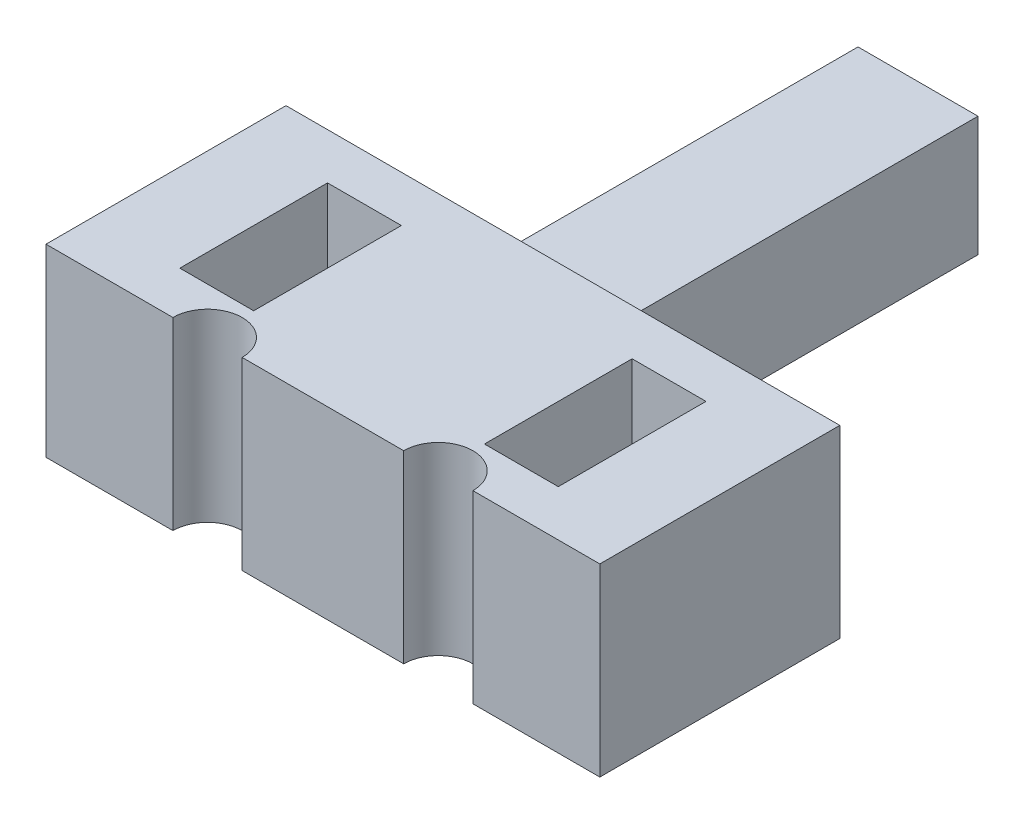
ISO-10303-21;
HEADER;
FILE_DESCRIPTION(('STEP AP214'),'2;1');
FILE_NAME('part.step','',(''),(''),'','','');
FILE_SCHEMA(('AUTOMOTIVE_DESIGN { 1 0 10303 214 1 1 1 1 }'));
ENDSEC;
DATA;
#1=APPLICATION_CONTEXT('core data for automotive mechanical design processes');
#2=APPLICATION_PROTOCOL_DEFINITION('international standard','automotive_design',2000,#1);
#3=PRODUCT_CONTEXT('',#1,'mechanical');
#4=PRODUCT('Part','Part','',(#3));
#5=PRODUCT_RELATED_PRODUCT_CATEGORY('part','',(#4));
#6=PRODUCT_DEFINITION_FORMATION('','',#4);
#7=PRODUCT_DEFINITION_CONTEXT('part definition',#1,'design');
#8=PRODUCT_DEFINITION('design','',#6,#7);
#9=PRODUCT_DEFINITION_SHAPE('','',#8);
#10=(LENGTH_UNIT() NAMED_UNIT(*) SI_UNIT(.MILLI.,.METRE.));
#11=(NAMED_UNIT(*) PLANE_ANGLE_UNIT() SI_UNIT($,.RADIAN.));
#12=(NAMED_UNIT(*) SI_UNIT($,.STERADIAN.) SOLID_ANGLE_UNIT());
#13=UNCERTAINTY_MEASURE_WITH_UNIT(LENGTH_MEASURE(1.E-05),#10,'distance_accuracy_value','');
#14=(GEOMETRIC_REPRESENTATION_CONTEXT(3) GLOBAL_UNCERTAINTY_ASSIGNED_CONTEXT((#13)) GLOBAL_UNIT_ASSIGNED_CONTEXT((#10,
#11,#12)) REPRESENTATION_CONTEXT('',''));
#15=CARTESIAN_POINT('',(0.,0.,0.));
#16=DIRECTION('',(0.,0.,1.));
#17=DIRECTION('',(1.,0.,0.));
#18=AXIS2_PLACEMENT_3D('',#15,#16,#17);
#19=CARTESIAN_POINT('',(-0.402957670863898,0.,-5.3));
#20=DIRECTION('',(-0.707106781186551,0.,-0.707106781186544));
#21=DIRECTION('',(-0.707106781186544,0.,0.707106781186551));
#22=AXIS2_PLACEMENT_3D('',#19,#20,#21);
#23=PLANE('',#22);
#24=DIRECTION('',(-0.577350269189624,0.577350269189625,0.577350269189629));
#25=VECTOR('',#24,1.);
#26=CARTESIAN_POINT('',(-0.402957670863898,1.64939499919042,-5.3));
#27=LINE('',#26,#25);
#28=CARTESIAN_POINT('',(-0.402957670863898,1.64939499919042,-5.3));
#29=VERTEX_POINT('',#28);
#30=CARTESIAN_POINT('',(-0.602957670863896,1.84939499919042,-5.1));
#31=VERTEX_POINT('',#30);
#32=EDGE_CURVE('E305',#29,#31,#27,.T.);
#33=ORIENTED_EDGE('',*,*,#32,.F.);
#34=DIRECTION('',(0.,1.,0.));
#35=VECTOR('',#34,1.);
#36=CARTESIAN_POINT('',(-0.402957670863898,0.,-5.3));
#37=LINE('',#36,#35);
#38=CARTESIAN_POINT('',(-0.402957670863898,0.749394999190415,-5.3));
#39=VERTEX_POINT('',#38);
#40=EDGE_CURVE('E300',#39,#29,#37,.T.);
#41=ORIENTED_EDGE('',*,*,#40,.F.);
#42=DIRECTION('',(0.577350269189624,0.577350269189624,-0.577350269189629));
#43=VECTOR('',#42,1.);
#44=CARTESIAN_POINT('',(-0.602957670863896,0.549394999190417,-5.1));
#45=LINE('',#44,#43);
#46=CARTESIAN_POINT('',(-0.602957670863896,0.549394999190417,-5.1));
#47=VERTEX_POINT('',#46);
#48=EDGE_CURVE('E294',#47,#39,#45,.T.);
#49=ORIENTED_EDGE('',*,*,#48,.F.);
#50=DIRECTION('',(0.,1.,0.));
#51=VECTOR('',#50,1.);
#52=CARTESIAN_POINT('',(-0.602957670863896,0.549394999190417,-5.1));
#53=LINE('',#52,#51);
#54=EDGE_CURVE('E283',#47,#31,#53,.T.);
#55=ORIENTED_EDGE('',*,*,#54,.T.);
#56=EDGE_LOOP('',(#33,#41,#49,#55));
#57=FACE_BOUND('',#56,.T.);
#58=ADVANCED_FACE('F17',(#57),#23,.T.);
#59=CARTESIAN_POINT('',(0.,1.64939499919042,-5.3));
#60=DIRECTION('',(0.,0.707106781186551,-0.707106781186545));
#61=DIRECTION('',(0.,0.707106781186545,0.707106781186551));
#62=AXIS2_PLACEMENT_3D('',#59,#60,#61);
#63=PLANE('',#62);
#64=DIRECTION('',(-0.577350269189625,-0.577350269189624,-0.577350269189629));
#65=VECTOR('',#64,1.);
#66=CARTESIAN_POINT('',(0.697042329136104,1.84939499919042,-5.1));
#67=LINE('',#66,#65);
#68=CARTESIAN_POINT('',(0.697042329136104,1.84939499919042,-5.1));
#69=VERTEX_POINT('',#68);
#70=CARTESIAN_POINT('',(0.497042329136106,1.64939499919042,-5.3));
#71=VERTEX_POINT('',#70);
#72=EDGE_CURVE('E303',#69,#71,#67,.T.);
#73=ORIENTED_EDGE('',*,*,#72,.T.);
#74=DIRECTION('',(-1.,0.,0.));
#75=VECTOR('',#74,1.);
#76=CARTESIAN_POINT('',(0.,1.64939499919042,-5.3));
#77=LINE('',#76,#75);
#78=EDGE_CURVE('E297',#29,#71,#77,.F.);
#79=ORIENTED_EDGE('',*,*,#78,.F.);
#80=ORIENTED_EDGE('',*,*,#32,.T.);
#81=DIRECTION('',(1.,0.,0.));
#82=VECTOR('',#81,1.);
#83=CARTESIAN_POINT('',(-0.602957670863896,1.84939499919042,-5.1));
#84=LINE('',#83,#82);
#85=EDGE_CURVE('E275',#31,#69,#84,.T.);
#86=ORIENTED_EDGE('',*,*,#85,.T.);
#87=EDGE_LOOP('',(#73,#79,#80,#86));
#88=FACE_BOUND('',#87,.T.);
#89=ADVANCED_FACE('F624',(#88),#63,.T.);
#90=CARTESIAN_POINT('',(0.,0.,-5.3));
#91=DIRECTION('',(0.,0.,-1.));
#92=DIRECTION('',(-1.,0.,0.));
#93=AXIS2_PLACEMENT_3D('',#90,#91,#92);
#94=PLANE('',#93);
#95=DIRECTION('',(0.,1.,0.));
#96=VECTOR('',#95,1.);
#97=CARTESIAN_POINT('',(0.497042329136106,0.,-5.3));
#98=LINE('',#97,#96);
#99=CARTESIAN_POINT('',(0.497042329136106,0.749394999190415,-5.3));
#100=VERTEX_POINT('',#99);
#101=EDGE_CURVE('E269',#100,#71,#98,.T.);
#102=ORIENTED_EDGE('',*,*,#101,.F.);
#103=DIRECTION('',(1.,0.,0.));
#104=VECTOR('',#103,1.);
#105=CARTESIAN_POINT('',(0.,0.749394999190415,-5.3));
#106=LINE('',#105,#104);
#107=EDGE_CURVE('E292',#39,#100,#106,.T.);
#108=ORIENTED_EDGE('',*,*,#107,.F.);
#109=ORIENTED_EDGE('',*,*,#40,.T.);
#110=ORIENTED_EDGE('',*,*,#78,.T.);
#111=EDGE_LOOP('',(#102,#108,#109,#110));
#112=FACE_BOUND('',#111,.T.);
#113=ADVANCED_FACE('F615',(#112),#94,.T.);
#114=CARTESIAN_POINT('',(0.,0.749394999190415,-5.3));
#115=DIRECTION('',(0.,-0.707106781186551,-0.707106781186544));
#116=DIRECTION('',(0.,0.707106781186544,-0.707106781186551));
#117=AXIS2_PLACEMENT_3D('',#114,#115,#116);
#118=PLANE('',#117);
#119=ORIENTED_EDGE('',*,*,#48,.T.);
#120=ORIENTED_EDGE('',*,*,#107,.T.);
#121=DIRECTION('',(-0.577350269189624,0.577350269189624,-0.577350269189629));
#122=VECTOR('',#121,1.);
#123=CARTESIAN_POINT('',(0.697042329136104,0.549394999190417,-5.1));
#124=LINE('',#123,#122);
#125=CARTESIAN_POINT('',(0.697042329136104,0.549394999190417,-5.1));
#126=VERTEX_POINT('',#125);
#127=EDGE_CURVE('E272',#126,#100,#124,.T.);
#128=ORIENTED_EDGE('',*,*,#127,.F.);
#129=DIRECTION('',(1.,0.,0.));
#130=VECTOR('',#129,1.);
#131=CARTESIAN_POINT('',(-0.602957670863896,0.549394999190417,-5.1));
#132=LINE('',#131,#130);
#133=EDGE_CURVE('E263',#126,#47,#132,.F.);
#134=ORIENTED_EDGE('',*,*,#133,.T.);
#135=EDGE_LOOP('',(#119,#120,#128,#134));
#136=FACE_BOUND('',#135,.T.);
#137=ADVANCED_FACE('F606',(#136),#118,.T.);
#138=CARTESIAN_POINT('',(-0.602957670863896,0.549394999190417,-5.3));
#139=DIRECTION('',(1.,0.,0.));
#140=DIRECTION('',(0.,0.,-1.));
#141=AXIS2_PLACEMENT_3D('',#138,#139,#140);
#142=PLANE('',#141);
#143=ORIENTED_EDGE('',*,*,#54,.F.);
#144=DIRECTION('',(0.,0.,1.));
#145=VECTOR('',#144,1.);
#146=CARTESIAN_POINT('',(-0.602957670863896,0.549394999190417,-5.3));
#147=LINE('',#146,#145);
#148=CARTESIAN_POINT('',(-0.602957670863896,0.549394999190417,-1.3));
#149=VERTEX_POINT('',#148);
#150=EDGE_CURVE('E255',#47,#149,#147,.T.);
#151=ORIENTED_EDGE('',*,*,#150,.T.);
#152=DIRECTION('',(0.,1.,0.));
#153=VECTOR('',#152,1.);
#154=CARTESIAN_POINT('',(-0.602957670863896,0.549394999190417,-1.3));
#155=LINE('',#154,#153);
#156=CARTESIAN_POINT('',(-0.602957670863896,1.84939499919042,-1.3));
#157=VERTEX_POINT('',#156);
#158=EDGE_CURVE('E290',#157,#149,#155,.F.);
#159=ORIENTED_EDGE('',*,*,#158,.F.);
#160=DIRECTION('',(0.,0.,1.));
#161=VECTOR('',#160,1.);
#162=CARTESIAN_POINT('',(-0.602957670863896,1.84939499919042,-5.3));
#163=LINE('',#162,#161);
#164=EDGE_CURVE('E278',#157,#31,#163,.F.);
#165=ORIENTED_EDGE('',*,*,#164,.T.);
#166=EDGE_LOOP('',(#143,#151,#159,#165));
#167=FACE_BOUND('',#166,.T.);
#168=ADVANCED_FACE('F598',(#167),#142,.F.);
#169=CARTESIAN_POINT('',(-1.25,1.,0.799999999999999));
#170=DIRECTION('',(0.,-1.,0.));
#171=DIRECTION('',(0.,0.,-1.));
#172=AXIS2_PLACEMENT_3D('',#169,#170,#171);
#173=PLANE('',#172);
#174=DIRECTION('',(-1.,0.,0.));
#175=VECTOR('',#174,1.);
#176=CARTESIAN_POINT('',(-1.25,1.,-0.800000000000001));
#177=LINE('',#176,#175);
#178=CARTESIAN_POINT('',(-1.25,1.,-0.800000000000001));
#179=VERTEX_POINT('',#178);
#180=CARTESIAN_POINT('',(-2.05,1.,-0.8));
#181=VERTEX_POINT('',#180);
#182=EDGE_CURVE('E234',#179,#181,#177,.T.);
#183=ORIENTED_EDGE('',*,*,#182,.T.);
#184=DIRECTION('',(0.,0.,1.));
#185=VECTOR('',#184,1.);
#186=CARTESIAN_POINT('',(-2.05,1.,-0.8));
#187=LINE('',#186,#185);
#188=CARTESIAN_POINT('',(-2.05,1.,0.8));
#189=VERTEX_POINT('',#188);
#190=EDGE_CURVE('E252',#181,#189,#187,.T.);
#191=ORIENTED_EDGE('',*,*,#190,.T.);
#192=DIRECTION('',(1.,0.,0.));
#193=VECTOR('',#192,1.);
#194=CARTESIAN_POINT('',(-1.25,1.,0.799999999999999));
#195=LINE('',#194,#193);
#196=CARTESIAN_POINT('',(-1.25,1.,0.799999999999999));
#197=VERTEX_POINT('',#196);
#198=EDGE_CURVE('E246',#189,#197,#195,.T.);
#199=ORIENTED_EDGE('',*,*,#198,.T.);
#200=DIRECTION('',(0.,0.,-1.));
#201=VECTOR('',#200,1.);
#202=CARTESIAN_POINT('',(-1.25,1.,-0.800000000000001));
#203=LINE('',#202,#201);
#204=EDGE_CURVE('E240',#197,#179,#203,.T.);
#205=ORIENTED_EDGE('',*,*,#204,.T.);
#206=EDGE_LOOP('',(#183,#191,#199,#205));
#207=FACE_BOUND('',#206,.T.);
#208=ADVANCED_FACE('F372',(#207),#173,.F.);
#209=CARTESIAN_POINT('',(2.05,1.,0.8));
#210=DIRECTION('',(0.,1.,0.));
#211=DIRECTION('',(0.,0.,1.));
#212=AXIS2_PLACEMENT_3D('',#209,#210,#211);
#213=PLANE('',#212);
#214=DIRECTION('',(0.,0.,1.));
#215=VECTOR('',#214,1.);
#216=CARTESIAN_POINT('',(1.25,1.,-0.8));
#217=LINE('',#216,#215);
#218=CARTESIAN_POINT('',(1.25,1.,-0.8));
#219=VERTEX_POINT('',#218);
#220=CARTESIAN_POINT('',(1.25,1.,0.8));
#221=VERTEX_POINT('',#220);
#222=EDGE_CURVE('E228',#219,#221,#217,.T.);
#223=ORIENTED_EDGE('',*,*,#222,.T.);
#224=DIRECTION('',(1.,0.,0.));
#225=VECTOR('',#224,1.);
#226=CARTESIAN_POINT('',(1.25,1.,0.8));
#227=LINE('',#226,#225);
#228=CARTESIAN_POINT('',(2.05,1.,0.8));
#229=VERTEX_POINT('',#228);
#230=EDGE_CURVE('E222',#221,#229,#227,.T.);
#231=ORIENTED_EDGE('',*,*,#230,.T.);
#232=DIRECTION('',(0.,0.,-1.));
#233=VECTOR('',#232,1.);
#234=CARTESIAN_POINT('',(2.05,1.,-0.8));
#235=LINE('',#234,#233);
#236=CARTESIAN_POINT('',(2.05,1.,-0.8));
#237=VERTEX_POINT('',#236);
#238=EDGE_CURVE('E216',#229,#237,#235,.T.);
#239=ORIENTED_EDGE('',*,*,#238,.T.);
#240=DIRECTION('',(-1.,0.,0.));
#241=VECTOR('',#240,1.);
#242=CARTESIAN_POINT('',(1.25,1.,-0.8));
#243=LINE('',#242,#241);
#244=EDGE_CURVE('E210',#237,#219,#243,.T.);
#245=ORIENTED_EDGE('',*,*,#244,.T.);
#246=EDGE_LOOP('',(#223,#231,#239,#245));
#247=FACE_BOUND('',#246,.T.);
#248=ADVANCED_FACE('F581',(#247),#213,.T.);
#249=CARTESIAN_POINT('',(-0.602957670863896,1.84939499919042,-5.3));
#250=DIRECTION('',(0.,-1.,0.));
#251=DIRECTION('',(1.,0.,0.));
#252=AXIS2_PLACEMENT_3D('',#249,#250,#251);
#253=PLANE('',#252);
#254=ORIENTED_EDGE('',*,*,#85,.F.);
#255=ORIENTED_EDGE('',*,*,#164,.F.);
#256=DIRECTION('',(1.,0.,0.));
#257=VECTOR('',#256,1.);
#258=CARTESIAN_POINT('',(-0.602957670863896,1.84939499919042,-1.3));
#259=LINE('',#258,#257);
#260=CARTESIAN_POINT('',(0.697042329136104,1.84939499919042,-1.3));
#261=VERTEX_POINT('',#260);
#262=EDGE_CURVE('E281',#261,#157,#259,.F.);
#263=ORIENTED_EDGE('',*,*,#262,.F.);
#264=DIRECTION('',(0.,0.,1.));
#265=VECTOR('',#264,1.);
#266=CARTESIAN_POINT('',(0.697042329136104,1.84939499919042,-5.3));
#267=LINE('',#266,#265);
#268=EDGE_CURVE('E186',#261,#69,#267,.F.);
#269=ORIENTED_EDGE('',*,*,#268,.T.);
#270=EDGE_LOOP('',(#254,#255,#263,#269));
#271=FACE_BOUND('',#270,.T.);
#272=ADVANCED_FACE('F572',(#271),#253,.F.);
#273=CARTESIAN_POINT('',(0.497042329136106,0.,-5.3));
#274=DIRECTION('',(0.707106781186551,0.,-0.707106781186544));
#275=DIRECTION('',(-0.707106781186544,0.,-0.707106781186551));
#276=AXIS2_PLACEMENT_3D('',#273,#274,#275);
#277=PLANE('',#276);
#278=ORIENTED_EDGE('',*,*,#72,.F.);
#279=DIRECTION('',(0.,1.,0.));
#280=VECTOR('',#279,1.);
#281=CARTESIAN_POINT('',(0.697042329136104,0.549394999190417,-5.1));
#282=LINE('',#281,#280);
#283=EDGE_CURVE('E183',#69,#126,#282,.F.);
#284=ORIENTED_EDGE('',*,*,#283,.T.);
#285=ORIENTED_EDGE('',*,*,#127,.T.);
#286=ORIENTED_EDGE('',*,*,#101,.T.);
#287=EDGE_LOOP('',(#278,#284,#285,#286));
#288=FACE_BOUND('',#287,.T.);
#289=ADVANCED_FACE('F563',(#288),#277,.T.);
#290=CARTESIAN_POINT('',(-0.602957670863896,0.549394999190417,-5.3));
#291=DIRECTION('',(0.,1.,0.));
#292=DIRECTION('',(0.,0.,1.));
#293=AXIS2_PLACEMENT_3D('',#290,#291,#292);
#294=PLANE('',#293);
#295=ORIENTED_EDGE('',*,*,#133,.F.);
#296=DIRECTION('',(0.,0.,1.));
#297=VECTOR('',#296,1.);
#298=CARTESIAN_POINT('',(0.697042329136104,0.549394999190417,-5.3));
#299=LINE('',#298,#297);
#300=CARTESIAN_POINT('',(0.697042329136104,0.549394999190417,-1.3));
#301=VERTEX_POINT('',#300);
#302=EDGE_CURVE('E180',#126,#301,#299,.T.);
#303=ORIENTED_EDGE('',*,*,#302,.T.);
#304=DIRECTION('',(1.,0.,0.));
#305=VECTOR('',#304,1.);
#306=CARTESIAN_POINT('',(-0.602957670863896,0.549394999190417,-1.3));
#307=LINE('',#306,#305);
#308=EDGE_CURVE('E266',#149,#301,#307,.T.);
#309=ORIENTED_EDGE('',*,*,#308,.F.);
#310=ORIENTED_EDGE('',*,*,#150,.F.);
#311=EDGE_LOOP('',(#295,#303,#309,#310));
#312=FACE_BOUND('',#311,.T.);
#313=ADVANCED_FACE('F555',(#312),#294,.F.);
#314=CARTESIAN_POINT('',(-2.05,1.,-0.8));
#315=DIRECTION('',(-1.,0.,0.));
#316=DIRECTION('',(0.,0.,1.));
#317=AXIS2_PLACEMENT_3D('',#314,#315,#316);
#318=PLANE('',#317);
#319=DIRECTION('',(0.,1.,0.));
#320=VECTOR('',#319,1.);
#321=CARTESIAN_POINT('',(-2.05,1.,0.8));
#322=LINE('',#321,#320);
#323=CARTESIAN_POINT('',(-2.05,2.,0.8));
#324=VERTEX_POINT('',#323);
#325=EDGE_CURVE('E249',#324,#189,#322,.F.);
#326=ORIENTED_EDGE('',*,*,#325,.T.);
#327=ORIENTED_EDGE('',*,*,#190,.F.);
#328=DIRECTION('',(0.,1.,0.));
#329=VECTOR('',#328,1.);
#330=CARTESIAN_POINT('',(-2.05,1.,-0.8));
#331=LINE('',#330,#329);
#332=CARTESIAN_POINT('',(-2.05,2.,-0.8));
#333=VERTEX_POINT('',#332);
#334=EDGE_CURVE('E231',#181,#333,#331,.T.);
#335=ORIENTED_EDGE('',*,*,#334,.T.);
#336=DIRECTION('',(0.,0.,-1.));
#337=VECTOR('',#336,1.);
#338=CARTESIAN_POINT('',(-2.05,2.,-1.3));
#339=LINE('',#338,#337);
#340=EDGE_CURVE('E176',#333,#324,#339,.F.);
#341=ORIENTED_EDGE('',*,*,#340,.T.);
#342=EDGE_LOOP('',(#326,#327,#335,#341));
#343=FACE_BOUND('',#342,.T.);
#344=ADVANCED_FACE('F377',(#343),#318,.F.);
#345=CARTESIAN_POINT('',(-1.25,1.,0.799999999999999));
#346=DIRECTION('',(0.,0.,1.));
#347=DIRECTION('',(1.,0.,0.));
#348=AXIS2_PLACEMENT_3D('',#345,#346,#347);
#349=PLANE('',#348);
#350=DIRECTION('',(0.,1.,0.));
#351=VECTOR('',#350,1.);
#352=CARTESIAN_POINT('',(-1.25,1.,0.799999999999999));
#353=LINE('',#352,#351);
#354=CARTESIAN_POINT('',(-1.25,2.,0.799999999999999));
#355=VERTEX_POINT('',#354);
#356=EDGE_CURVE('E243',#355,#197,#353,.F.);
#357=ORIENTED_EDGE('',*,*,#356,.T.);
#358=ORIENTED_EDGE('',*,*,#198,.F.);
#359=ORIENTED_EDGE('',*,*,#325,.F.);
#360=DIRECTION('',(1.,0.,0.));
#361=VECTOR('',#360,1.);
#362=CARTESIAN_POINT('',(3.,2.,0.8));
#363=LINE('',#362,#361);
#364=EDGE_CURVE('E173',#324,#355,#363,.T.);
#365=ORIENTED_EDGE('',*,*,#364,.T.);
#366=EDGE_LOOP('',(#357,#358,#359,#365));
#367=FACE_BOUND('',#366,.T.);
#368=ADVANCED_FACE('F381',(#367),#349,.F.);
#369=CARTESIAN_POINT('',(-1.25,1.,-0.800000000000001));
#370=DIRECTION('',(1.,0.,0.));
#371=DIRECTION('',(0.,0.,-1.));
#372=AXIS2_PLACEMENT_3D('',#369,#370,#371);
#373=PLANE('',#372);
#374=DIRECTION('',(0.,1.,0.));
#375=VECTOR('',#374,1.);
#376=CARTESIAN_POINT('',(-1.25,1.,-0.800000000000001));
#377=LINE('',#376,#375);
#378=CARTESIAN_POINT('',(-1.25,2.,-0.800000000000001));
#379=VERTEX_POINT('',#378);
#380=EDGE_CURVE('E237',#379,#179,#377,.F.);
#381=ORIENTED_EDGE('',*,*,#380,.T.);
#382=ORIENTED_EDGE('',*,*,#204,.F.);
#383=ORIENTED_EDGE('',*,*,#356,.F.);
#384=DIRECTION('',(0.,0.,-1.));
#385=VECTOR('',#384,1.);
#386=CARTESIAN_POINT('',(-1.25,2.,-1.3));
#387=LINE('',#386,#385);
#388=EDGE_CURVE('E170',#355,#379,#387,.T.);
#389=ORIENTED_EDGE('',*,*,#388,.T.);
#390=EDGE_LOOP('',(#381,#382,#383,#389));
#391=FACE_BOUND('',#390,.T.);
#392=ADVANCED_FACE('F386',(#391),#373,.F.);
#393=CARTESIAN_POINT('',(-1.25,1.,-0.800000000000001));
#394=DIRECTION('',(0.,0.,-1.));
#395=DIRECTION('',(-1.,0.,0.));
#396=AXIS2_PLACEMENT_3D('',#393,#394,#395);
#397=PLANE('',#396);
#398=ORIENTED_EDGE('',*,*,#334,.F.);
#399=ORIENTED_EDGE('',*,*,#182,.F.);
#400=ORIENTED_EDGE('',*,*,#380,.F.);
#401=DIRECTION('',(1.,0.,0.));
#402=VECTOR('',#401,1.);
#403=CARTESIAN_POINT('',(3.,2.,-0.800000000000001));
#404=LINE('',#403,#402);
#405=EDGE_CURVE('E167',#379,#333,#404,.F.);
#406=ORIENTED_EDGE('',*,*,#405,.T.);
#407=EDGE_LOOP('',(#398,#399,#400,#406));
#408=FACE_BOUND('',#407,.T.);
#409=ADVANCED_FACE('F390',(#408),#397,.F.);
#410=CARTESIAN_POINT('',(1.25,1.,-0.8));
#411=DIRECTION('',(-1.,0.,0.));
#412=DIRECTION('',(0.,0.,1.));
#413=AXIS2_PLACEMENT_3D('',#410,#411,#412);
#414=PLANE('',#413);
#415=DIRECTION('',(0.,1.,0.));
#416=VECTOR('',#415,1.);
#417=CARTESIAN_POINT('',(1.25,1.,0.8));
#418=LINE('',#417,#416);
#419=CARTESIAN_POINT('',(1.25,2.,0.8));
#420=VERTEX_POINT('',#419);
#421=EDGE_CURVE('E225',#420,#221,#418,.F.);
#422=ORIENTED_EDGE('',*,*,#421,.T.);
#423=ORIENTED_EDGE('',*,*,#222,.F.);
#424=DIRECTION('',(0.,1.,0.));
#425=VECTOR('',#424,1.);
#426=CARTESIAN_POINT('',(1.25,1.,-0.8));
#427=LINE('',#426,#425);
#428=CARTESIAN_POINT('',(1.25,2.,-0.8));
#429=VERTEX_POINT('',#428);
#430=EDGE_CURVE('E107',#219,#429,#427,.T.);
#431=ORIENTED_EDGE('',*,*,#430,.T.);
#432=DIRECTION('',(0.,0.,-1.));
#433=VECTOR('',#432,1.);
#434=CARTESIAN_POINT('',(1.25,2.,-1.3));
#435=LINE('',#434,#433);
#436=EDGE_CURVE('E164',#429,#420,#435,.F.);
#437=ORIENTED_EDGE('',*,*,#436,.T.);
#438=EDGE_LOOP('',(#422,#423,#431,#437));
#439=FACE_BOUND('',#438,.T.);
#440=ADVANCED_FACE('F517',(#439),#414,.F.);
#441=CARTESIAN_POINT('',(1.25,1.,0.8));
#442=DIRECTION('',(0.,0.,1.));
#443=DIRECTION('',(1.,0.,0.));
#444=AXIS2_PLACEMENT_3D('',#441,#442,#443);
#445=PLANE('',#444);
#446=DIRECTION('',(0.,1.,0.));
#447=VECTOR('',#446,1.);
#448=CARTESIAN_POINT('',(2.05,1.,0.8));
#449=LINE('',#448,#447);
#450=CARTESIAN_POINT('',(2.05,2.,0.8));
#451=VERTEX_POINT('',#450);
#452=EDGE_CURVE('E219',#451,#229,#449,.F.);
#453=ORIENTED_EDGE('',*,*,#452,.T.);
#454=ORIENTED_EDGE('',*,*,#230,.F.);
#455=ORIENTED_EDGE('',*,*,#421,.F.);
#456=DIRECTION('',(1.,0.,0.));
#457=VECTOR('',#456,1.);
#458=CARTESIAN_POINT('',(3.,2.,0.8));
#459=LINE('',#458,#457);
#460=EDGE_CURVE('E161',#420,#451,#459,.T.);
#461=ORIENTED_EDGE('',*,*,#460,.T.);
#462=EDGE_LOOP('',(#453,#454,#455,#461));
#463=FACE_BOUND('',#462,.T.);
#464=ADVANCED_FACE('F508',(#463),#445,.F.);
#465=CARTESIAN_POINT('',(2.05,1.,-0.8));
#466=DIRECTION('',(1.,0.,0.));
#467=DIRECTION('',(0.,0.,-1.));
#468=AXIS2_PLACEMENT_3D('',#465,#466,#467);
#469=PLANE('',#468);
#470=DIRECTION('',(0.,1.,0.));
#471=VECTOR('',#470,1.);
#472=CARTESIAN_POINT('',(2.05,1.,-0.8));
#473=LINE('',#472,#471);
#474=CARTESIAN_POINT('',(2.05,2.,-0.8));
#475=VERTEX_POINT('',#474);
#476=EDGE_CURVE('E213',#475,#237,#473,.F.);
#477=ORIENTED_EDGE('',*,*,#476,.T.);
#478=ORIENTED_EDGE('',*,*,#238,.F.);
#479=ORIENTED_EDGE('',*,*,#452,.F.);
#480=DIRECTION('',(0.,0.,-1.));
#481=VECTOR('',#480,1.);
#482=CARTESIAN_POINT('',(2.05,2.,-1.3));
#483=LINE('',#482,#481);
#484=EDGE_CURVE('E158',#451,#475,#483,.T.);
#485=ORIENTED_EDGE('',*,*,#484,.T.);
#486=EDGE_LOOP('',(#477,#478,#479,#485));
#487=FACE_BOUND('',#486,.T.);
#488=ADVANCED_FACE('F499',(#487),#469,.F.);
#489=CARTESIAN_POINT('',(1.25,1.,-0.8));
#490=DIRECTION('',(0.,0.,-1.));
#491=DIRECTION('',(-1.,0.,0.));
#492=AXIS2_PLACEMENT_3D('',#489,#490,#491);
#493=PLANE('',#492);
#494=ORIENTED_EDGE('',*,*,#430,.F.);
#495=ORIENTED_EDGE('',*,*,#244,.F.);
#496=ORIENTED_EDGE('',*,*,#476,.F.);
#497=DIRECTION('',(1.,0.,0.));
#498=VECTOR('',#497,1.);
#499=CARTESIAN_POINT('',(3.,2.,-0.8));
#500=LINE('',#499,#498);
#501=EDGE_CURVE('E155',#475,#429,#500,.F.);
#502=ORIENTED_EDGE('',*,*,#501,.T.);
#503=EDGE_LOOP('',(#494,#495,#496,#502));
#504=FACE_BOUND('',#503,.T.);
#505=ADVANCED_FACE('F491',(#504),#493,.F.);
#506=CARTESIAN_POINT('',(-1.25,0.,1.3));
#507=DIRECTION('',(0.,1.,0.));
#508=DIRECTION('',(0.,0.,1.));
#509=AXIS2_PLACEMENT_3D('',#506,#507,#508);
#510=CYLINDRICAL_SURFACE('',#509,0.375);
#511=DIRECTION('',(0.,1.,0.));
#512=VECTOR('',#511,1.);
#513=CARTESIAN_POINT('',(-0.874999999999999,2.,1.3));
#514=LINE('',#513,#512);
#515=CARTESIAN_POINT('',(-0.874999999999999,0.,1.3));
#516=VERTEX_POINT('',#515);
#517=CARTESIAN_POINT('',(-0.874999999999999,2.,1.3));
#518=VERTEX_POINT('',#517);
#519=EDGE_CURVE('E99',#516,#518,#514,.T.);
#520=ORIENTED_EDGE('',*,*,#519,.T.);
#521=CARTESIAN_POINT('',(-1.25,2.,1.3));
#522=DIRECTION('',(0.,1.,0.));
#523=DIRECTION('',(0.,0.,1.));
#524=AXIS2_PLACEMENT_3D('',#521,#522,#523);
#525=CIRCLE('',#524,0.375);
#526=CARTESIAN_POINT('',(-1.625,2.,1.3));
#527=VERTEX_POINT('',#526);
#528=EDGE_CURVE('E152',#518,#527,#525,.T.);
#529=ORIENTED_EDGE('',*,*,#528,.T.);
#530=DIRECTION('',(0.,1.,0.));
#531=VECTOR('',#530,1.);
#532=CARTESIAN_POINT('',(-1.625,2.,1.3));
#533=LINE('',#532,#531);
#534=CARTESIAN_POINT('',(-1.625,0.,1.3));
#535=VERTEX_POINT('',#534);
#536=EDGE_CURVE('E102',#527,#535,#533,.F.);
#537=ORIENTED_EDGE('',*,*,#536,.T.);
#538=CARTESIAN_POINT('',(-1.25,0.,1.3));
#539=DIRECTION('',(0.,1.,0.));
#540=DIRECTION('',(0.,0.,1.));
#541=AXIS2_PLACEMENT_3D('',#538,#539,#540);
#542=CIRCLE('',#541,0.375);
#543=EDGE_CURVE('E20',#516,#535,#542,.T.);
#544=ORIENTED_EDGE('',*,*,#543,.F.);
#545=EDGE_LOOP('',(#520,#529,#537,#544));
#546=FACE_BOUND('',#545,.T.);
#547=ADVANCED_FACE('F98',(#546),#510,.F.);
#548=CARTESIAN_POINT('',(1.25,0.,1.3));
#549=DIRECTION('',(0.,1.,0.));
#550=DIRECTION('',(0.,0.,1.));
#551=AXIS2_PLACEMENT_3D('',#548,#549,#550);
#552=CYLINDRICAL_SURFACE('',#551,0.375);
#553=DIRECTION('',(0.,1.,0.));
#554=VECTOR('',#553,1.);
#555=CARTESIAN_POINT('',(1.625,2.,1.3));
#556=LINE('',#555,#554);
#557=CARTESIAN_POINT('',(1.625,0.,1.3));
#558=VERTEX_POINT('',#557);
#559=CARTESIAN_POINT('',(1.625,2.,1.3));
#560=VERTEX_POINT('',#559);
#561=EDGE_CURVE('E179',#558,#560,#556,.T.);
#562=ORIENTED_EDGE('',*,*,#561,.T.);
#563=CARTESIAN_POINT('',(1.25,2.,1.3));
#564=DIRECTION('',(0.,1.,0.));
#565=DIRECTION('',(0.,0.,1.));
#566=AXIS2_PLACEMENT_3D('',#563,#564,#565);
#567=CIRCLE('',#566,0.375);
#568=CARTESIAN_POINT('',(0.875,2.,1.3));
#569=VERTEX_POINT('',#568);
#570=EDGE_CURVE('E116',#560,#569,#567,.T.);
#571=ORIENTED_EDGE('',*,*,#570,.T.);
#572=DIRECTION('',(0.,1.,0.));
#573=VECTOR('',#572,1.);
#574=CARTESIAN_POINT('',(0.875,2.,1.3));
#575=LINE('',#574,#573);
#576=CARTESIAN_POINT('',(0.875,0.,1.3));
#577=VERTEX_POINT('',#576);
#578=EDGE_CURVE('E141',#569,#577,#575,.F.);
#579=ORIENTED_EDGE('',*,*,#578,.T.);
#580=CARTESIAN_POINT('',(1.25,0.,1.3));
#581=DIRECTION('',(0.,1.,0.));
#582=DIRECTION('',(0.,0.,1.));
#583=AXIS2_PLACEMENT_3D('',#580,#581,#582);
#584=CIRCLE('',#583,0.375);
#585=EDGE_CURVE('E106',#558,#577,#584,.T.);
#586=ORIENTED_EDGE('',*,*,#585,.F.);
#587=EDGE_LOOP('',(#562,#571,#579,#586));
#588=FACE_BOUND('',#587,.T.);
#589=ADVANCED_FACE('F475',(#588),#552,.F.);
#590=CARTESIAN_POINT('',(-3.,2.,1.3));
#591=DIRECTION('',(0.,0.,-1.));
#592=DIRECTION('',(-1.,0.,0.));
#593=AXIS2_PLACEMENT_3D('',#590,#591,#592);
#594=PLANE('',#593);
#595=ORIENTED_EDGE('',*,*,#536,.F.);
#596=DIRECTION('',(1.,0.,0.));
#597=VECTOR('',#596,1.);
#598=CARTESIAN_POINT('',(3.,2.,1.3));
#599=LINE('',#598,#597);
#600=CARTESIAN_POINT('',(-3.,2.,1.3));
#601=VERTEX_POINT('',#600);
#602=EDGE_CURVE('E147',#527,#601,#599,.F.);
#603=ORIENTED_EDGE('',*,*,#602,.T.);
#604=DIRECTION('',(0.,1.,0.));
#605=VECTOR('',#604,1.);
#606=CARTESIAN_POINT('',(-3.,2.,1.3));
#607=LINE('',#606,#605);
#608=CARTESIAN_POINT('',(-3.,0.,1.3));
#609=VERTEX_POINT('',#608);
#610=EDGE_CURVE('E140',#601,#609,#607,.F.);
#611=ORIENTED_EDGE('',*,*,#610,.T.);
#612=DIRECTION('',(-1.,0.,0.));
#613=VECTOR('',#612,1.);
#614=CARTESIAN_POINT('',(-3.,0.,1.3));
#615=LINE('',#614,#613);
#616=EDGE_CURVE('E189',#535,#609,#615,.T.);
#617=ORIENTED_EDGE('',*,*,#616,.F.);
#618=EDGE_LOOP('',(#595,#603,#611,#617));
#619=FACE_BOUND('',#618,.T.);
#620=ADVANCED_FACE('F312',(#619),#594,.F.);
#621=CARTESIAN_POINT('',(0.697042329136104,0.549394999190417,-5.3));
#622=DIRECTION('',(-1.,0.,0.));
#623=DIRECTION('',(0.,0.,1.));
#624=AXIS2_PLACEMENT_3D('',#621,#622,#623);
#625=PLANE('',#624);
#626=ORIENTED_EDGE('',*,*,#283,.F.);
#627=ORIENTED_EDGE('',*,*,#268,.F.);
#628=DIRECTION('',(0.,1.,0.));
#629=VECTOR('',#628,1.);
#630=CARTESIAN_POINT('',(0.697042329136104,2.,-1.3));
#631=LINE('',#630,#629);
#632=EDGE_CURVE('E130',#261,#301,#631,.F.);
#633=ORIENTED_EDGE('',*,*,#632,.T.);
#634=ORIENTED_EDGE('',*,*,#302,.F.);
#635=EDGE_LOOP('',(#626,#627,#633,#634));
#636=FACE_BOUND('',#635,.T.);
#637=ADVANCED_FACE('F401',(#636),#625,.F.);
#638=CARTESIAN_POINT('',(-3.,2.,1.3));
#639=DIRECTION('',(0.,0.,-1.));
#640=DIRECTION('',(-1.,0.,0.));
#641=AXIS2_PLACEMENT_3D('',#638,#639,#640);
#642=PLANE('',#641);
#643=ORIENTED_EDGE('',*,*,#561,.F.);
#644=DIRECTION('',(-1.,0.,0.));
#645=VECTOR('',#644,1.);
#646=CARTESIAN_POINT('',(-3.,0.,1.3));
#647=LINE('',#646,#645);
#648=CARTESIAN_POINT('',(3.,0.,1.3));
#649=VERTEX_POINT('',#648);
#650=EDGE_CURVE('E35',#649,#558,#647,.T.);
#651=ORIENTED_EDGE('',*,*,#650,.F.);
#652=DIRECTION('',(0.,1.,0.));
#653=VECTOR('',#652,1.);
#654=CARTESIAN_POINT('',(3.,2.,1.3));
#655=LINE('',#654,#653);
#656=CARTESIAN_POINT('',(3.,2.,1.3));
#657=VERTEX_POINT('',#656);
#658=EDGE_CURVE('E133',#649,#657,#655,.T.);
#659=ORIENTED_EDGE('',*,*,#658,.T.);
#660=DIRECTION('',(1.,0.,0.));
#661=VECTOR('',#660,1.);
#662=CARTESIAN_POINT('',(3.,2.,1.3));
#663=LINE('',#662,#661);
#664=EDGE_CURVE('E144',#657,#560,#663,.F.);
#665=ORIENTED_EDGE('',*,*,#664,.T.);
#666=EDGE_LOOP('',(#643,#651,#659,#665));
#667=FACE_BOUND('',#666,.T.);
#668=ADVANCED_FACE('F393',(#667),#642,.F.);
#669=CARTESIAN_POINT('',(3.,2.,-1.3));
#670=DIRECTION('',(0.,-1.,0.));
#671=DIRECTION('',(0.,0.,-1.));
#672=AXIS2_PLACEMENT_3D('',#669,#670,#671);
#673=PLANE('',#672);
#674=ORIENTED_EDGE('',*,*,#570,.F.);
#675=ORIENTED_EDGE('',*,*,#664,.F.);
#676=DIRECTION('',(0.,0.,1.));
#677=VECTOR('',#676,1.);
#678=CARTESIAN_POINT('',(3.,2.,1.3));
#679=LINE('',#678,#677);
#680=CARTESIAN_POINT('',(3.,2.,-1.3));
#681=VERTEX_POINT('',#680);
#682=EDGE_CURVE('E126',#657,#681,#679,.F.);
#683=ORIENTED_EDGE('',*,*,#682,.T.);
#684=DIRECTION('',(1.,0.,0.));
#685=VECTOR('',#684,1.);
#686=CARTESIAN_POINT('',(-3.,2.,-1.3));
#687=LINE('',#686,#685);
#688=CARTESIAN_POINT('',(-3.,2.,-1.3));
#689=VERTEX_POINT('',#688);
#690=EDGE_CURVE('E137',#681,#689,#687,.F.);
#691=ORIENTED_EDGE('',*,*,#690,.T.);
#692=DIRECTION('',(0.,0.,-1.));
#693=VECTOR('',#692,1.);
#694=CARTESIAN_POINT('',(-3.,2.,1.3));
#695=LINE('',#694,#693);
#696=EDGE_CURVE('E142',#689,#601,#695,.F.);
#697=ORIENTED_EDGE('',*,*,#696,.T.);
#698=ORIENTED_EDGE('',*,*,#602,.F.);
#699=ORIENTED_EDGE('',*,*,#528,.F.);
#700=DIRECTION('',(-1.,0.,0.));
#701=VECTOR('',#700,1.);
#702=CARTESIAN_POINT('',(-3.,2.,1.3));
#703=LINE('',#702,#701);
#704=EDGE_CURVE('E115',#518,#569,#703,.F.);
#705=ORIENTED_EDGE('',*,*,#704,.T.);
#706=EDGE_LOOP('',(#674,#675,#683,#691,#697,#698,#699,#705));
#707=FACE_BOUND('',#706,.T.);
#708=ORIENTED_EDGE('',*,*,#484,.F.);
#709=ORIENTED_EDGE('',*,*,#460,.F.);
#710=ORIENTED_EDGE('',*,*,#436,.F.);
#711=ORIENTED_EDGE('',*,*,#501,.F.);
#712=EDGE_LOOP('',(#708,#709,#710,#711));
#713=FACE_BOUND('',#712,.T.);
#714=ORIENTED_EDGE('',*,*,#388,.F.);
#715=ORIENTED_EDGE('',*,*,#364,.F.);
#716=ORIENTED_EDGE('',*,*,#340,.F.);
#717=ORIENTED_EDGE('',*,*,#405,.F.);
#718=EDGE_LOOP('',(#714,#715,#716,#717));
#719=FACE_BOUND('',#718,.T.);
#720=ADVANCED_FACE('F314',(#707,#713,#719),#673,.F.);
#721=CARTESIAN_POINT('',(-3.,2.,1.3));
#722=DIRECTION('',(0.,0.,-1.));
#723=DIRECTION('',(-1.,0.,0.));
#724=AXIS2_PLACEMENT_3D('',#721,#722,#723);
#725=PLANE('',#724);
#726=ORIENTED_EDGE('',*,*,#578,.F.);
#727=ORIENTED_EDGE('',*,*,#704,.F.);
#728=ORIENTED_EDGE('',*,*,#519,.F.);
#729=DIRECTION('',(1.,0.,0.));
#730=VECTOR('',#729,1.);
#731=CARTESIAN_POINT('',(3.,0.,1.3));
#732=LINE('',#731,#730);
#733=EDGE_CURVE('E113',#577,#516,#732,.F.);
#734=ORIENTED_EDGE('',*,*,#733,.F.);
#735=EDGE_LOOP('',(#726,#727,#728,#734));
#736=FACE_BOUND('',#735,.T.);
#737=ADVANCED_FACE('F112',(#736),#725,.F.);
#738=CARTESIAN_POINT('',(-3.,2.,1.3));
#739=DIRECTION('',(1.,0.,0.));
#740=DIRECTION('',(0.,0.,-1.));
#741=AXIS2_PLACEMENT_3D('',#738,#739,#740);
#742=PLANE('',#741);
#743=ORIENTED_EDGE('',*,*,#610,.F.);
#744=ORIENTED_EDGE('',*,*,#696,.F.);
#745=DIRECTION('',(0.,1.,0.));
#746=VECTOR('',#745,1.);
#747=CARTESIAN_POINT('',(-3.,2.,-1.3));
#748=LINE('',#747,#746);
#749=CARTESIAN_POINT('',(-3.,0.,-1.3));
#750=VERTEX_POINT('',#749);
#751=EDGE_CURVE('E134',#689,#750,#748,.F.);
#752=ORIENTED_EDGE('',*,*,#751,.T.);
#753=DIRECTION('',(0.,0.,-1.));
#754=VECTOR('',#753,1.);
#755=CARTESIAN_POINT('',(-3.,0.,-1.3));
#756=LINE('',#755,#754);
#757=EDGE_CURVE('E121',#609,#750,#756,.T.);
#758=ORIENTED_EDGE('',*,*,#757,.F.);
#759=EDGE_LOOP('',(#743,#744,#752,#758));
#760=FACE_BOUND('',#759,.T.);
#761=ADVANCED_FACE('F324',(#760),#742,.F.);
#762=CARTESIAN_POINT('',(-3.,2.,-1.3));
#763=DIRECTION('',(0.,0.,1.));
#764=DIRECTION('',(1.,0.,0.));
#765=AXIS2_PLACEMENT_3D('',#762,#763,#764);
#766=PLANE('',#765);
#767=ORIENTED_EDGE('',*,*,#262,.T.);
#768=ORIENTED_EDGE('',*,*,#158,.T.);
#769=ORIENTED_EDGE('',*,*,#308,.T.);
#770=ORIENTED_EDGE('',*,*,#632,.F.);
#771=EDGE_LOOP('',(#767,#768,#769,#770));
#772=FACE_BOUND('',#771,.T.);
#773=ORIENTED_EDGE('',*,*,#751,.F.);
#774=ORIENTED_EDGE('',*,*,#690,.F.);
#775=DIRECTION('',(0.,1.,0.));
#776=VECTOR('',#775,1.);
#777=CARTESIAN_POINT('',(3.,2.,-1.3));
#778=LINE('',#777,#776);
#779=CARTESIAN_POINT('',(3.,0.,-1.3));
#780=VERTEX_POINT('',#779);
#781=EDGE_CURVE('E122',#681,#780,#778,.F.);
#782=ORIENTED_EDGE('',*,*,#781,.T.);
#783=DIRECTION('',(1.,0.,0.));
#784=VECTOR('',#783,1.);
#785=CARTESIAN_POINT('',(3.,0.,-1.3));
#786=LINE('',#785,#784);
#787=EDGE_CURVE('E26',#750,#780,#786,.T.);
#788=ORIENTED_EDGE('',*,*,#787,.F.);
#789=EDGE_LOOP('',(#773,#774,#782,#788));
#790=FACE_BOUND('',#789,.T.);
#791=ADVANCED_FACE('F409',(#772,#790),#766,.F.);
#792=CARTESIAN_POINT('',(3.,2.,1.3));
#793=DIRECTION('',(-1.,0.,0.));
#794=DIRECTION('',(0.,0.,1.));
#795=AXIS2_PLACEMENT_3D('',#792,#793,#794);
#796=PLANE('',#795);
#797=ORIENTED_EDGE('',*,*,#781,.F.);
#798=ORIENTED_EDGE('',*,*,#682,.F.);
#799=ORIENTED_EDGE('',*,*,#658,.F.);
#800=DIRECTION('',(0.,0.,-1.));
#801=VECTOR('',#800,1.);
#802=CARTESIAN_POINT('',(3.,0.,-1.3));
#803=LINE('',#802,#801);
#804=EDGE_CURVE('E11',#780,#649,#803,.F.);
#805=ORIENTED_EDGE('',*,*,#804,.F.);
#806=EDGE_LOOP('',(#797,#798,#799,#805));
#807=FACE_BOUND('',#806,.T.);
#808=ADVANCED_FACE('F404',(#807),#796,.F.);
#809=CARTESIAN_POINT('',(3.,0.,-1.3));
#810=DIRECTION('',(0.,-1.,0.));
#811=DIRECTION('',(0.,0.,-1.));
#812=AXIS2_PLACEMENT_3D('',#809,#810,#811);
#813=PLANE('',#812);
#814=ORIENTED_EDGE('',*,*,#804,.T.);
#815=ORIENTED_EDGE('',*,*,#650,.T.);
#816=ORIENTED_EDGE('',*,*,#585,.T.);
#817=ORIENTED_EDGE('',*,*,#733,.T.);
#818=ORIENTED_EDGE('',*,*,#543,.T.);
#819=ORIENTED_EDGE('',*,*,#616,.T.);
#820=ORIENTED_EDGE('',*,*,#757,.T.);
#821=ORIENTED_EDGE('',*,*,#787,.T.);
#822=EDGE_LOOP('',(#814,#815,#816,#817,#818,#819,#820,#821));
#823=FACE_BOUND('',#822,.T.);
#824=ADVANCED_FACE('F118',(#823),#813,.T.);
#825=CLOSED_SHELL('',(#58,#89,#113,#137,#168,#208,#248,#272,#289,#313,#344,#368,#392,#409,#440,
#464,#488,#505,#547,#589,#620,#637,#668,#720,#737,#761,#791,#808,#824));
#826=MANIFOLD_SOLID_BREP('B1',#825);
#827=ADVANCED_BREP_SHAPE_REPRESENTATION('',(#18,#826),#14);
#828=SHAPE_DEFINITION_REPRESENTATION(#9,#827);
ENDSEC;
END-ISO-10303-21;
